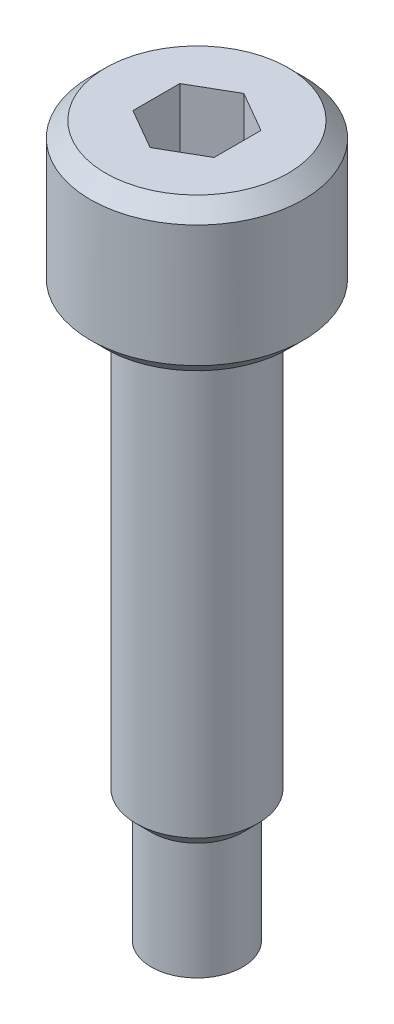
ISO-10303-21;
HEADER;
FILE_DESCRIPTION(('STEP AP214'),'2;1');
FILE_NAME('part.step','',(''),(''),'','','');
FILE_SCHEMA(('AUTOMOTIVE_DESIGN { 1 0 10303 214 1 1 1 1 }'));
ENDSEC;
DATA;
#1=APPLICATION_CONTEXT('core data for automotive mechanical design processes');
#2=APPLICATION_PROTOCOL_DEFINITION('international standard','automotive_design',2000,#1);
#3=PRODUCT_CONTEXT('',#1,'mechanical');
#4=PRODUCT('Part','Part','',(#3));
#5=PRODUCT_RELATED_PRODUCT_CATEGORY('part','',(#4));
#6=PRODUCT_DEFINITION_FORMATION('','',#4);
#7=PRODUCT_DEFINITION_CONTEXT('part definition',#1,'design');
#8=PRODUCT_DEFINITION('design','',#6,#7);
#9=PRODUCT_DEFINITION_SHAPE('','',#8);
#10=(LENGTH_UNIT() NAMED_UNIT(*) SI_UNIT(.MILLI.,.METRE.));
#11=(NAMED_UNIT(*) PLANE_ANGLE_UNIT() SI_UNIT($,.RADIAN.));
#12=(NAMED_UNIT(*) SI_UNIT($,.STERADIAN.) SOLID_ANGLE_UNIT());
#13=UNCERTAINTY_MEASURE_WITH_UNIT(LENGTH_MEASURE(1.E-05),#10,'distance_accuracy_value','');
#14=(GEOMETRIC_REPRESENTATION_CONTEXT(3) GLOBAL_UNCERTAINTY_ASSIGNED_CONTEXT((#13)) GLOBAL_UNIT_ASSIGNED_CONTEXT((#10,
#11,#12)) REPRESENTATION_CONTEXT('',''));
#15=CARTESIAN_POINT('',(0.,0.,0.));
#16=DIRECTION('',(0.,0.,1.));
#17=DIRECTION('',(1.,0.,0.));
#18=AXIS2_PLACEMENT_3D('',#15,#16,#17);
#19=CARTESIAN_POINT('',(0.,0.,0.));
#20=DIRECTION('',(0.,1.,0.));
#21=DIRECTION('',(-1.,0.,0.));
#22=AXIS2_PLACEMENT_3D('',#19,#20,#21);
#23=PLANE('',#22);
#24=CARTESIAN_POINT('',(0.,0.,0.));
#25=DIRECTION('',(0.,1.,0.));
#26=DIRECTION('',(-1.,0.,0.));
#27=AXIS2_PLACEMENT_3D('',#24,#25,#26);
#28=CIRCLE('',#27,4.5);
#29=CARTESIAN_POINT('',(-4.5,0.,0.));
#30=VERTEX_POINT('',#29);
#31=EDGE_CURVE('E180',#30,#30,#28,.T.);
#32=ORIENTED_EDGE('',*,*,#31,.F.);
#33=EDGE_LOOP('',(#32));
#34=FACE_BOUND('',#33,.T.);
#35=ADVANCED_FACE('F47',(#34),#23,.F.);
#36=CARTESIAN_POINT('',(0.,70.,0.));
#37=DIRECTION('',(0.,1.,0.));
#38=DIRECTION('',(-1.,0.,0.));
#39=AXIS2_PLACEMENT_3D('',#36,#37,#38);
#40=CYLINDRICAL_SURFACE('',#39,4.5);
#41=CARTESIAN_POINT('',(0.,11.5,0.));
#42=DIRECTION('',(0.,1.,0.));
#43=DIRECTION('',(-1.,0.,0.));
#44=AXIS2_PLACEMENT_3D('',#41,#42,#43);
#45=CIRCLE('',#44,4.5);
#46=CARTESIAN_POINT('',(-4.5,11.5,0.));
#47=VERTEX_POINT('',#46);
#48=EDGE_CURVE('E176',#47,#47,#45,.T.);
#49=ORIENTED_EDGE('',*,*,#48,.F.);
#50=EDGE_LOOP('',(#49));
#51=FACE_BOUND('',#50,.T.);
#52=ORIENTED_EDGE('',*,*,#31,.T.);
#53=EDGE_LOOP('',(#52));
#54=FACE_BOUND('',#53,.T.);
#55=ADVANCED_FACE('F232',(#51,#54),#40,.T.);
#56=CARTESIAN_POINT('',(0.,70.,0.));
#57=DIRECTION('',(0.,1.,0.));
#58=DIRECTION('',(-1.,0.,0.));
#59=AXIS2_PLACEMENT_3D('',#56,#57,#58);
#60=CYLINDRICAL_SURFACE('',#59,6.00000000000001);
#61=CARTESIAN_POINT('',(0.,13.,0.));
#62=DIRECTION('',(0.,1.,0.));
#63=DIRECTION('',(-1.,0.,0.));
#64=AXIS2_PLACEMENT_3D('',#61,#62,#63);
#65=CIRCLE('',#64,6.00000000000001);
#66=CARTESIAN_POINT('',(-6.00000000000001,13.,0.));
#67=VERTEX_POINT('',#66);
#68=EDGE_CURVE('E184',#67,#67,#65,.T.);
#69=ORIENTED_EDGE('',*,*,#68,.T.);
#70=EDGE_LOOP('',(#69));
#71=FACE_BOUND('',#70,.T.);
#72=CARTESIAN_POINT('',(0.,55.,0.));
#73=DIRECTION('',(0.,1.,0.));
#74=DIRECTION('',(-1.,0.,0.));
#75=AXIS2_PLACEMENT_3D('',#72,#73,#74);
#76=CIRCLE('',#75,6.00000000000001);
#77=CARTESIAN_POINT('',(-6.00000000000001,55.,0.));
#78=VERTEX_POINT('',#77);
#79=EDGE_CURVE('E163',#78,#78,#76,.T.);
#80=ORIENTED_EDGE('',*,*,#79,.F.);
#81=EDGE_LOOP('',(#80));
#82=FACE_BOUND('',#81,.T.);
#83=ADVANCED_FACE('F238',(#71,#82),#60,.T.);
#84=CARTESIAN_POINT('',(6.00000000000001,55.,0.));
#85=DIRECTION('',(0.,1.,0.));
#86=DIRECTION('',(-1.,0.,0.));
#87=AXIS2_PLACEMENT_3D('',#84,#85,#86);
#88=PLANE('',#87);
#89=CARTESIAN_POINT('',(0.,55.,0.));
#90=DIRECTION('',(0.,1.,0.));
#91=DIRECTION('',(-1.,0.,0.));
#92=AXIS2_PLACEMENT_3D('',#89,#90,#91);
#93=CIRCLE('',#92,9.00000000000001);
#94=CARTESIAN_POINT('',(-9.00000000000001,55.,0.));
#95=VERTEX_POINT('',#94);
#96=EDGE_CURVE('E57',#95,#95,#93,.F.);
#97=ORIENTED_EDGE('',*,*,#96,.T.);
#98=EDGE_LOOP('',(#97));
#99=FACE_BOUND('',#98,.T.);
#100=ORIENTED_EDGE('',*,*,#79,.T.);
#101=EDGE_LOOP('',(#100));
#102=FACE_BOUND('',#101,.T.);
#103=ADVANCED_FACE('F199',(#99,#102),#88,.F.);
#104=CARTESIAN_POINT('',(0.,70.,0.));
#105=DIRECTION('',(0.,1.,0.));
#106=DIRECTION('',(-1.,0.,0.));
#107=AXIS2_PLACEMENT_3D('',#104,#105,#106);
#108=CYLINDRICAL_SURFACE('',#107,10.5);
#109=CARTESIAN_POINT('',(0.,56.5,0.));
#110=DIRECTION('',(0.,1.,0.));
#111=DIRECTION('',(-1.,0.,0.));
#112=AXIS2_PLACEMENT_3D('',#109,#110,#111);
#113=CIRCLE('',#112,10.5);
#114=CARTESIAN_POINT('',(-10.5,56.5,0.));
#115=VERTEX_POINT('',#114);
#116=EDGE_CURVE('E192',#115,#115,#113,.T.);
#117=ORIENTED_EDGE('',*,*,#116,.T.);
#118=EDGE_LOOP('',(#117));
#119=FACE_BOUND('',#118,.T.);
#120=CARTESIAN_POINT('',(0.,68.5,0.));
#121=DIRECTION('',(0.,-1.,0.));
#122=DIRECTION('',(1.,0.,0.));
#123=AXIS2_PLACEMENT_3D('',#120,#121,#122);
#124=CIRCLE('',#123,10.5);
#125=CARTESIAN_POINT('',(10.5,68.5,0.));
#126=VERTEX_POINT('',#125);
#127=EDGE_CURVE('E188',#126,#126,#124,.T.);
#128=ORIENTED_EDGE('',*,*,#127,.T.);
#129=EDGE_LOOP('',(#128));
#130=FACE_BOUND('',#129,.T.);
#131=ADVANCED_FACE('F208',(#119,#130),#108,.T.);
#132=CARTESIAN_POINT('',(10.5,70.,0.));
#133=DIRECTION('',(0.,-1.,0.));
#134=DIRECTION('',(1.,0.,0.));
#135=AXIS2_PLACEMENT_3D('',#132,#133,#134);
#136=PLANE('',#135);
#137=DIRECTION('',(-0.866025403784439,0.,0.5));
#138=VECTOR('',#137,1.);
#139=CARTESIAN_POINT('',(0.,70.,-4.61880215351701));
#140=LINE('',#139,#138);
#141=CARTESIAN_POINT('',(0.,70.,-4.61880215351701));
#142=VERTEX_POINT('',#141);
#143=CARTESIAN_POINT('',(-4.,70.,-2.30940107675851));
#144=VERTEX_POINT('',#143);
#145=EDGE_CURVE('E144',#142,#144,#140,.T.);
#146=ORIENTED_EDGE('',*,*,#145,.F.);
#147=DIRECTION('',(-0.866025403784439,0.,-0.5));
#148=VECTOR('',#147,1.);
#149=CARTESIAN_POINT('',(4.,70.,-2.3094010767585));
#150=LINE('',#149,#148);
#151=CARTESIAN_POINT('',(4.,70.,-2.3094010767585));
#152=VERTEX_POINT('',#151);
#153=EDGE_CURVE('E64',#152,#142,#150,.T.);
#154=ORIENTED_EDGE('',*,*,#153,.F.);
#155=DIRECTION('',(0.,0.,-1.));
#156=VECTOR('',#155,1.);
#157=CARTESIAN_POINT('',(4.,70.,2.3094010767585));
#158=LINE('',#157,#156);
#159=CARTESIAN_POINT('',(4.,70.,2.3094010767585));
#160=VERTEX_POINT('',#159);
#161=EDGE_CURVE('E157',#160,#152,#158,.T.);
#162=ORIENTED_EDGE('',*,*,#161,.F.);
#163=DIRECTION('',(0.866025403784439,0.,-0.5));
#164=VECTOR('',#163,1.);
#165=CARTESIAN_POINT('',(0.,70.,4.61880215351701));
#166=LINE('',#165,#164);
#167=CARTESIAN_POINT('',(0.,70.,4.61880215351701));
#168=VERTEX_POINT('',#167);
#169=EDGE_CURVE('E154',#168,#160,#166,.T.);
#170=ORIENTED_EDGE('',*,*,#169,.F.);
#171=DIRECTION('',(0.866025403784439,0.,0.5));
#172=VECTOR('',#171,1.);
#173=CARTESIAN_POINT('',(-4.,70.,2.3094010767585));
#174=LINE('',#173,#172);
#175=CARTESIAN_POINT('',(-4.,70.,2.3094010767585));
#176=VERTEX_POINT('',#175);
#177=EDGE_CURVE('E112',#176,#168,#174,.T.);
#178=ORIENTED_EDGE('',*,*,#177,.F.);
#179=DIRECTION('',(0.,0.,1.));
#180=VECTOR('',#179,1.);
#181=CARTESIAN_POINT('',(-4.,70.,-2.30940107675851));
#182=LINE('',#181,#180);
#183=EDGE_CURVE('E148',#144,#176,#182,.T.);
#184=ORIENTED_EDGE('',*,*,#183,.F.);
#185=EDGE_LOOP('',(#146,#154,#162,#170,#178,#184));
#186=FACE_BOUND('',#185,.T.);
#187=CARTESIAN_POINT('',(0.,70.,0.));
#188=DIRECTION('',(0.,-1.,0.));
#189=DIRECTION('',(1.,0.,0.));
#190=AXIS2_PLACEMENT_3D('',#187,#188,#189);
#191=CIRCLE('',#190,9.);
#192=CARTESIAN_POINT('',(9.,70.,0.));
#193=VERTEX_POINT('',#192);
#194=EDGE_CURVE('E11',#193,#193,#191,.F.);
#195=ORIENTED_EDGE('',*,*,#194,.T.);
#196=EDGE_LOOP('',(#195));
#197=FACE_BOUND('',#196,.T.);
#198=ADVANCED_FACE('F211',(#186,#197),#136,.F.);
#199=CARTESIAN_POINT('',(0.,13.,0.));
#200=DIRECTION('',(0.,1.,0.));
#201=DIRECTION('',(-1.,0.,0.));
#202=AXIS2_PLACEMENT_3D('',#199,#200,#201);
#203=CONICAL_SURFACE('',#202,6.00000000000001,0.785398163397447);
#204=ORIENTED_EDGE('',*,*,#48,.T.);
#205=EDGE_LOOP('',(#204));
#206=FACE_BOUND('',#205,.T.);
#207=ORIENTED_EDGE('',*,*,#68,.F.);
#208=EDGE_LOOP('',(#207));
#209=FACE_BOUND('',#208,.T.);
#210=ADVANCED_FACE('F205',(#206,#209),#203,.T.);
#211=CARTESIAN_POINT('',(0.,56.5,0.));
#212=DIRECTION('',(0.,1.,0.));
#213=DIRECTION('',(-1.,0.,0.));
#214=AXIS2_PLACEMENT_3D('',#211,#212,#213);
#215=CONICAL_SURFACE('',#214,10.5,0.785398163397455);
#216=ORIENTED_EDGE('',*,*,#96,.F.);
#217=EDGE_LOOP('',(#216));
#218=FACE_BOUND('',#217,.T.);
#219=ORIENTED_EDGE('',*,*,#116,.F.);
#220=EDGE_LOOP('',(#219));
#221=FACE_BOUND('',#220,.T.);
#222=ADVANCED_FACE('F202',(#218,#221),#215,.T.);
#223=CARTESIAN_POINT('',(0.,70.,0.));
#224=DIRECTION('',(0.,-1.,0.));
#225=DIRECTION('',(1.,0.,0.));
#226=AXIS2_PLACEMENT_3D('',#223,#224,#225);
#227=CONICAL_SURFACE('',#226,9.,0.785398163397448);
#228=ORIENTED_EDGE('',*,*,#127,.F.);
#229=EDGE_LOOP('',(#228));
#230=FACE_BOUND('',#229,.T.);
#231=ORIENTED_EDGE('',*,*,#194,.F.);
#232=EDGE_LOOP('',(#231));
#233=FACE_BOUND('',#232,.T.);
#234=ADVANCED_FACE('F50',(#230,#233),#227,.T.);
#235=CARTESIAN_POINT('',(4.,62.,-2.3094010767585));
#236=DIRECTION('',(0.5,0.,-0.866025403784439));
#237=DIRECTION('',(-0.866025403784439,0.,-0.5));
#238=AXIS2_PLACEMENT_3D('',#235,#236,#237);
#239=PLANE('',#238);
#240=ORIENTED_EDGE('',*,*,#153,.T.);
#241=DIRECTION('',(0.,1.,0.));
#242=VECTOR('',#241,1.);
#243=CARTESIAN_POINT('',(0.,62.,-4.61880215351701));
#244=LINE('',#243,#242);
#245=CARTESIAN_POINT('',(0.,62.,-4.61880215351701));
#246=VERTEX_POINT('',#245);
#247=EDGE_CURVE('E94',#246,#142,#244,.T.);
#248=ORIENTED_EDGE('',*,*,#247,.F.);
#249=DIRECTION('',(-0.866025403784439,0.,-0.5));
#250=VECTOR('',#249,1.);
#251=CARTESIAN_POINT('',(4.,62.,-2.3094010767585));
#252=LINE('',#251,#250);
#253=CARTESIAN_POINT('',(4.,62.,-2.3094010767585));
#254=VERTEX_POINT('',#253);
#255=EDGE_CURVE('E160',#254,#246,#252,.T.);
#256=ORIENTED_EDGE('',*,*,#255,.F.);
#257=DIRECTION('',(0.,1.,0.));
#258=VECTOR('',#257,1.);
#259=CARTESIAN_POINT('',(4.,62.,-2.3094010767585));
#260=LINE('',#259,#258);
#261=EDGE_CURVE('E72',#254,#152,#260,.T.);
#262=ORIENTED_EDGE('',*,*,#261,.T.);
#263=EDGE_LOOP('',(#240,#248,#256,#262));
#264=FACE_BOUND('',#263,.T.);
#265=ADVANCED_FACE('F217',(#264),#239,.F.);
#266=CARTESIAN_POINT('',(4.,62.,2.3094010767585));
#267=DIRECTION('',(1.,0.,0.));
#268=DIRECTION('',(0.,0.,-1.));
#269=AXIS2_PLACEMENT_3D('',#266,#267,#268);
#270=PLANE('',#269);
#271=ORIENTED_EDGE('',*,*,#161,.T.);
#272=ORIENTED_EDGE('',*,*,#261,.F.);
#273=DIRECTION('',(0.,0.,-1.));
#274=VECTOR('',#273,1.);
#275=CARTESIAN_POINT('',(4.,62.,2.3094010767585));
#276=LINE('',#275,#274);
#277=CARTESIAN_POINT('',(4.,62.,2.3094010767585));
#278=VERTEX_POINT('',#277);
#279=EDGE_CURVE('E126',#278,#254,#276,.T.);
#280=ORIENTED_EDGE('',*,*,#279,.F.);
#281=DIRECTION('',(0.,1.,0.));
#282=VECTOR('',#281,1.);
#283=CARTESIAN_POINT('',(4.,62.,2.3094010767585));
#284=LINE('',#283,#282);
#285=EDGE_CURVE('E117',#278,#160,#284,.T.);
#286=ORIENTED_EDGE('',*,*,#285,.T.);
#287=EDGE_LOOP('',(#271,#272,#280,#286));
#288=FACE_BOUND('',#287,.T.);
#289=ADVANCED_FACE('F288',(#288),#270,.F.);
#290=CARTESIAN_POINT('',(0.,62.,4.61880215351701));
#291=DIRECTION('',(0.5,0.,0.866025403784439));
#292=DIRECTION('',(0.866025403784439,0.,-0.5));
#293=AXIS2_PLACEMENT_3D('',#290,#291,#292);
#294=PLANE('',#293);
#295=ORIENTED_EDGE('',*,*,#169,.T.);
#296=ORIENTED_EDGE('',*,*,#285,.F.);
#297=DIRECTION('',(0.866025403784439,0.,-0.5));
#298=VECTOR('',#297,1.);
#299=CARTESIAN_POINT('',(0.,62.,4.61880215351701));
#300=LINE('',#299,#298);
#301=CARTESIAN_POINT('',(0.,62.,4.61880215351701));
#302=VERTEX_POINT('',#301);
#303=EDGE_CURVE('E121',#302,#278,#300,.T.);
#304=ORIENTED_EDGE('',*,*,#303,.F.);
#305=DIRECTION('',(0.,1.,0.));
#306=VECTOR('',#305,1.);
#307=CARTESIAN_POINT('',(0.,62.,4.61880215351701));
#308=LINE('',#307,#306);
#309=EDGE_CURVE('E105',#302,#168,#308,.T.);
#310=ORIENTED_EDGE('',*,*,#309,.T.);
#311=EDGE_LOOP('',(#295,#296,#304,#310));
#312=FACE_BOUND('',#311,.T.);
#313=ADVANCED_FACE('F122',(#312),#294,.F.);
#314=CARTESIAN_POINT('',(-4.,62.,2.3094010767585));
#315=DIRECTION('',(-0.5,0.,0.866025403784439));
#316=DIRECTION('',(0.866025403784439,0.,0.5));
#317=AXIS2_PLACEMENT_3D('',#314,#315,#316);
#318=PLANE('',#317);
#319=ORIENTED_EDGE('',*,*,#177,.T.);
#320=ORIENTED_EDGE('',*,*,#309,.F.);
#321=DIRECTION('',(0.866025403784439,0.,0.5));
#322=VECTOR('',#321,1.);
#323=CARTESIAN_POINT('',(-4.,62.,2.3094010767585));
#324=LINE('',#323,#322);
#325=CARTESIAN_POINT('',(-4.,62.,2.3094010767585));
#326=VERTEX_POINT('',#325);
#327=EDGE_CURVE('E109',#326,#302,#324,.T.);
#328=ORIENTED_EDGE('',*,*,#327,.F.);
#329=DIRECTION('',(0.,1.,0.));
#330=VECTOR('',#329,1.);
#331=CARTESIAN_POINT('',(-4.,62.,2.3094010767585));
#332=LINE('',#331,#330);
#333=EDGE_CURVE('E118',#326,#176,#332,.T.);
#334=ORIENTED_EDGE('',*,*,#333,.T.);
#335=EDGE_LOOP('',(#319,#320,#328,#334));
#336=FACE_BOUND('',#335,.T.);
#337=ADVANCED_FACE('F107',(#336),#318,.F.);
#338=CARTESIAN_POINT('',(-4.,62.,-2.30940107675851));
#339=DIRECTION('',(-1.,0.,0.));
#340=DIRECTION('',(0.,-1.,0.));
#341=AXIS2_PLACEMENT_3D('',#338,#339,#340);
#342=PLANE('',#341);
#343=ORIENTED_EDGE('',*,*,#183,.T.);
#344=ORIENTED_EDGE('',*,*,#333,.F.);
#345=DIRECTION('',(0.,0.,1.));
#346=VECTOR('',#345,1.);
#347=CARTESIAN_POINT('',(-4.,62.,-2.30940107675851));
#348=LINE('',#347,#346);
#349=CARTESIAN_POINT('',(-4.,62.,-2.30940107675851));
#350=VERTEX_POINT('',#349);
#351=EDGE_CURVE('E132',#350,#326,#348,.T.);
#352=ORIENTED_EDGE('',*,*,#351,.F.);
#353=DIRECTION('',(0.,1.,0.));
#354=VECTOR('',#353,1.);
#355=CARTESIAN_POINT('',(-4.,62.,-2.30940107675851));
#356=LINE('',#355,#354);
#357=EDGE_CURVE('E168',#350,#144,#356,.T.);
#358=ORIENTED_EDGE('',*,*,#357,.T.);
#359=EDGE_LOOP('',(#343,#344,#352,#358));
#360=FACE_BOUND('',#359,.T.);
#361=ADVANCED_FACE('F312',(#360),#342,.F.);
#362=CARTESIAN_POINT('',(0.,62.,-4.61880215351701));
#363=DIRECTION('',(-0.5,0.,-0.866025403784439));
#364=DIRECTION('',(-0.866025403784439,0.,0.5));
#365=AXIS2_PLACEMENT_3D('',#362,#363,#364);
#366=PLANE('',#365);
#367=ORIENTED_EDGE('',*,*,#145,.T.);
#368=ORIENTED_EDGE('',*,*,#357,.F.);
#369=DIRECTION('',(-0.866025403784439,0.,0.5));
#370=VECTOR('',#369,1.);
#371=CARTESIAN_POINT('',(0.,62.,-4.61880215351701));
#372=LINE('',#371,#370);
#373=EDGE_CURVE('E136',#246,#350,#372,.T.);
#374=ORIENTED_EDGE('',*,*,#373,.F.);
#375=ORIENTED_EDGE('',*,*,#247,.T.);
#376=EDGE_LOOP('',(#367,#368,#374,#375));
#377=FACE_BOUND('',#376,.T.);
#378=ADVANCED_FACE('F321',(#377),#366,.F.);
#379=CARTESIAN_POINT('',(0.,62.,0.));
#380=DIRECTION('',(0.,1.,0.));
#381=DIRECTION('',(0.,0.,1.));
#382=AXIS2_PLACEMENT_3D('',#379,#380,#381);
#383=PLANE('',#382);
#384=ORIENTED_EDGE('',*,*,#255,.T.);
#385=ORIENTED_EDGE('',*,*,#373,.T.);
#386=ORIENTED_EDGE('',*,*,#351,.T.);
#387=ORIENTED_EDGE('',*,*,#327,.T.);
#388=ORIENTED_EDGE('',*,*,#303,.T.);
#389=ORIENTED_EDGE('',*,*,#279,.T.);
#390=EDGE_LOOP('',(#384,#385,#386,#387,#388,#389));
#391=FACE_BOUND('',#390,.T.);
#392=ADVANCED_FACE('F129',(#391),#383,.T.);
#393=CLOSED_SHELL('',(#35,#55,#83,#103,#131,#198,#210,#222,#234,#265,#289,#313,#337,#361,#378,#392));
#394=MANIFOLD_SOLID_BREP('B2',#393);
#395=ADVANCED_BREP_SHAPE_REPRESENTATION('',(#18,#394),#14);
#396=SHAPE_DEFINITION_REPRESENTATION(#9,#395);
ENDSEC;
END-ISO-10303-21;
